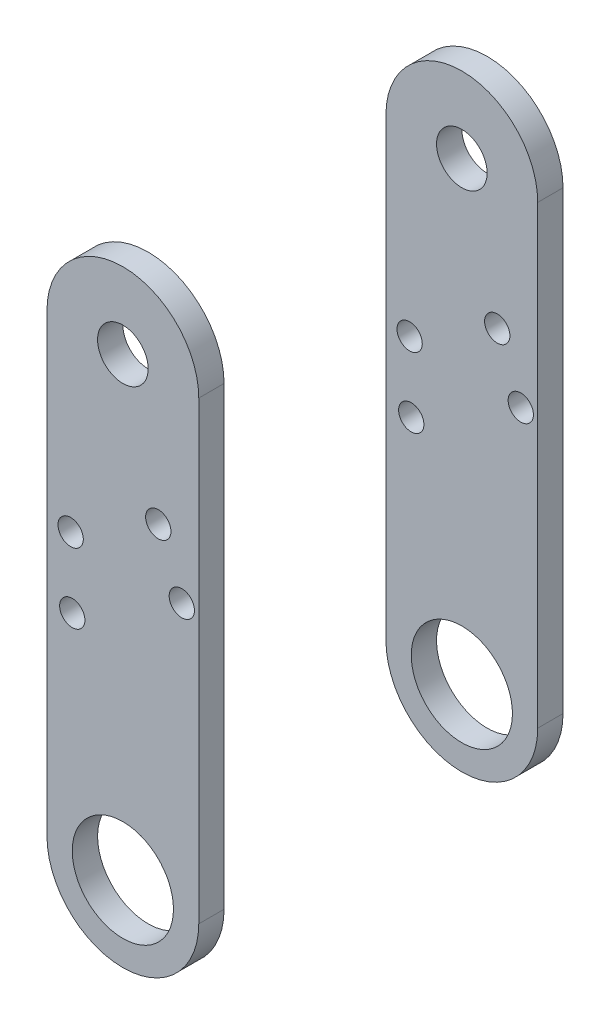
ISO-10303-21;
HEADER;
FILE_DESCRIPTION(('STEP AP214'),'2;1');
FILE_NAME('part.step','',(''),(''),'','','');
FILE_SCHEMA(('AUTOMOTIVE_DESIGN { 1 0 10303 214 1 1 1 1 }'));
ENDSEC;
DATA;
#1=APPLICATION_CONTEXT('core data for automotive mechanical design processes');
#2=APPLICATION_PROTOCOL_DEFINITION('international standard','automotive_design',2000,#1);
#3=PRODUCT_CONTEXT('',#1,'mechanical');
#4=PRODUCT('Part','Part','',(#3));
#5=PRODUCT_RELATED_PRODUCT_CATEGORY('part','',(#4));
#6=PRODUCT_DEFINITION_FORMATION('','',#4);
#7=PRODUCT_DEFINITION_CONTEXT('part definition',#1,'design');
#8=PRODUCT_DEFINITION('design','',#6,#7);
#9=PRODUCT_DEFINITION_SHAPE('','',#8);
#10=(LENGTH_UNIT() NAMED_UNIT(*) SI_UNIT(.MILLI.,.METRE.));
#11=(NAMED_UNIT(*) PLANE_ANGLE_UNIT() SI_UNIT($,.RADIAN.));
#12=(NAMED_UNIT(*) SI_UNIT($,.STERADIAN.) SOLID_ANGLE_UNIT());
#13=UNCERTAINTY_MEASURE_WITH_UNIT(LENGTH_MEASURE(1.E-05),#10,'distance_accuracy_value','');
#14=(GEOMETRIC_REPRESENTATION_CONTEXT(3) GLOBAL_UNCERTAINTY_ASSIGNED_CONTEXT((#13)) GLOBAL_UNIT_ASSIGNED_CONTEXT((#10,
#11,#12)) REPRESENTATION_CONTEXT('',''));
#15=CARTESIAN_POINT('',(0.,0.,0.));
#16=DIRECTION('',(0.,0.,1.));
#17=DIRECTION('',(1.,0.,0.));
#18=AXIS2_PLACEMENT_3D('',#15,#16,#17);
#19=CARTESIAN_POINT('',(11.650635094611,53.21224929608,72.));
#20=DIRECTION('',(0.,0.,-1.));
#21=DIRECTION('',(0.,1.,0.));
#22=AXIS2_PLACEMENT_3D('',#19,#20,#21);
#23=CYLINDRICAL_SURFACE('',#22,2.5);
#24=CARTESIAN_POINT('',(11.650635094611,53.21224929608,4.99999999999999));
#25=DIRECTION('',(0.,0.,-1.));
#26=DIRECTION('',(-1.,0.,0.));
#27=AXIS2_PLACEMENT_3D('',#24,#25,#26);
#28=CIRCLE('',#27,2.5);
#29=CARTESIAN_POINT('',(9.15063509461096,53.21224929608,4.99999999999999));
#30=VERTEX_POINT('',#29);
#31=EDGE_CURVE('E167',#30,#30,#28,.F.);
#32=ORIENTED_EDGE('',*,*,#31,.T.);
#33=EDGE_LOOP('',(#32));
#34=FACE_BOUND('',#33,.T.);
#35=CARTESIAN_POINT('',(11.650635094611,53.21224929608,0.));
#36=DIRECTION('',(0.,0.,-1.));
#37=DIRECTION('',(0.,1.,0.));
#38=AXIS2_PLACEMENT_3D('',#35,#36,#37);
#39=CIRCLE('',#38,2.5);
#40=CARTESIAN_POINT('',(11.650635094611,55.71224929608,0.));
#41=VERTEX_POINT('',#40);
#42=EDGE_CURVE('E164',#41,#41,#39,.T.);
#43=ORIENTED_EDGE('',*,*,#42,.T.);
#44=EDGE_LOOP('',(#43));
#45=FACE_BOUND('',#44,.T.);
#46=ADVANCED_FACE('F73',(#34,#45),#23,.F.);
#47=CARTESIAN_POINT('',(-10.,40.71224929608,72.));
#48=DIRECTION('',(0.,0.,-1.));
#49=DIRECTION('',(0.,1.,0.));
#50=AXIS2_PLACEMENT_3D('',#47,#48,#49);
#51=CYLINDRICAL_SURFACE('',#50,2.5);
#52=CARTESIAN_POINT('',(-10.,40.71224929608,4.99999999999999));
#53=DIRECTION('',(0.,0.,-1.));
#54=DIRECTION('',(-1.,0.,0.));
#55=AXIS2_PLACEMENT_3D('',#52,#53,#54);
#56=CIRCLE('',#55,2.5);
#57=CARTESIAN_POINT('',(-12.5,40.71224929608,4.99999999999999));
#58=VERTEX_POINT('',#57);
#59=EDGE_CURVE('E163',#58,#58,#56,.F.);
#60=ORIENTED_EDGE('',*,*,#59,.T.);
#61=EDGE_LOOP('',(#60));
#62=FACE_BOUND('',#61,.T.);
#63=CARTESIAN_POINT('',(-10.,40.71224929608,0.));
#64=DIRECTION('',(0.,0.,-1.));
#65=DIRECTION('',(0.,1.,0.));
#66=AXIS2_PLACEMENT_3D('',#63,#64,#65);
#67=CIRCLE('',#66,2.5);
#68=CARTESIAN_POINT('',(-10.,43.21224929608,0.));
#69=VERTEX_POINT('',#68);
#70=EDGE_CURVE('E160',#69,#69,#67,.T.);
#71=ORIENTED_EDGE('',*,*,#70,.T.);
#72=EDGE_LOOP('',(#71));
#73=FACE_BOUND('',#72,.T.);
#74=ADVANCED_FACE('F178',(#62,#73),#51,.F.);
#75=CARTESIAN_POINT('',(-10.3205080756888,54.4114817289327,72.));
#76=DIRECTION('',(0.,0.,-1.));
#77=DIRECTION('',(0.,1.,0.));
#78=AXIS2_PLACEMENT_3D('',#75,#76,#77);
#79=CYLINDRICAL_SURFACE('',#78,2.5);
#80=CARTESIAN_POINT('',(-10.3205080756888,54.4114817289327,4.99999999999999));
#81=DIRECTION('',(0.,0.,-1.));
#82=DIRECTION('',(-1.,0.,0.));
#83=AXIS2_PLACEMENT_3D('',#80,#81,#82);
#84=CIRCLE('',#83,2.5);
#85=CARTESIAN_POINT('',(-12.8205080756888,54.4114817289327,4.99999999999999));
#86=VERTEX_POINT('',#85);
#87=EDGE_CURVE('E77',#86,#86,#84,.F.);
#88=ORIENTED_EDGE('',*,*,#87,.T.);
#89=EDGE_LOOP('',(#88));
#90=FACE_BOUND('',#89,.T.);
#91=CARTESIAN_POINT('',(-10.3205080756888,54.4114817289327,0.));
#92=DIRECTION('',(0.,0.,-1.));
#93=DIRECTION('',(0.,1.,0.));
#94=AXIS2_PLACEMENT_3D('',#91,#92,#93);
#95=CIRCLE('',#94,2.5);
#96=CARTESIAN_POINT('',(-10.3205080756888,56.9114817289327,0.));
#97=VERTEX_POINT('',#96);
#98=EDGE_CURVE('E168',#97,#97,#95,.T.);
#99=ORIENTED_EDGE('',*,*,#98,.T.);
#100=EDGE_LOOP('',(#99));
#101=FACE_BOUND('',#100,.T.);
#102=ADVANCED_FACE('F191',(#90,#101),#79,.F.);
#103=CARTESIAN_POINT('',(7.,64.4114817289327,72.));
#104=DIRECTION('',(0.,0.,-1.));
#105=DIRECTION('',(0.,1.,0.));
#106=AXIS2_PLACEMENT_3D('',#103,#104,#105);
#107=CYLINDRICAL_SURFACE('',#106,2.5);
#108=CARTESIAN_POINT('',(7.,64.4114817289327,4.99999999999999));
#109=DIRECTION('',(0.,0.,-1.));
#110=DIRECTION('',(-1.,0.,0.));
#111=AXIS2_PLACEMENT_3D('',#108,#109,#110);
#112=CIRCLE('',#111,2.5);
#113=CARTESIAN_POINT('',(4.5,64.4114817289327,4.99999999999999));
#114=VERTEX_POINT('',#113);
#115=EDGE_CURVE('E171',#114,#114,#112,.F.);
#116=ORIENTED_EDGE('',*,*,#115,.T.);
#117=EDGE_LOOP('',(#116));
#118=FACE_BOUND('',#117,.T.);
#119=CARTESIAN_POINT('',(7.,64.4114817289327,0.));
#120=DIRECTION('',(0.,0.,-1.));
#121=DIRECTION('',(0.,1.,0.));
#122=AXIS2_PLACEMENT_3D('',#119,#120,#121);
#123=CIRCLE('',#122,2.5);
#124=CARTESIAN_POINT('',(7.,66.9114817289327,0.));
#125=VERTEX_POINT('',#124);
#126=EDGE_CURVE('E158',#125,#125,#123,.T.);
#127=ORIENTED_EDGE('',*,*,#126,.T.);
#128=EDGE_LOOP('',(#127));
#129=FACE_BOUND('',#128,.T.);
#130=ADVANCED_FACE('F75',(#118,#129),#107,.F.);
#131=CARTESIAN_POINT('',(55.,115.,4.99999999999999));
#132=DIRECTION('',(0.,0.,-1.));
#133=DIRECTION('',(0.,1.,0.));
#134=AXIS2_PLACEMENT_3D('',#131,#132,#133);
#135=PLANE('',#134);
#136=CARTESIAN_POINT('',(0.,90.,4.99999999999999));
#137=DIRECTION('',(0.,0.,-1.));
#138=DIRECTION('',(0.,1.,0.));
#139=AXIS2_PLACEMENT_3D('',#136,#137,#138);
#140=CIRCLE('',#139,15.);
#141=CARTESIAN_POINT('',(-15.,90.,5.));
#142=VERTEX_POINT('',#141);
#143=CARTESIAN_POINT('',(15.,90.,4.99999999999999));
#144=VERTEX_POINT('',#143);
#145=EDGE_CURVE('E128',#142,#144,#140,.T.);
#146=ORIENTED_EDGE('',*,*,#145,.F.);
#147=DIRECTION('',(0.,-1.,0.));
#148=VECTOR('',#147,1.);
#149=CARTESIAN_POINT('',(-15.,115.,4.99999999999999));
#150=LINE('',#149,#148);
#151=CARTESIAN_POINT('',(-15.,0.,5.00000000000002));
#152=VERTEX_POINT('',#151);
#153=EDGE_CURVE('E125',#142,#152,#150,.T.);
#154=ORIENTED_EDGE('',*,*,#153,.T.);
#155=CARTESIAN_POINT('',(0.,0.,5.00000000000002));
#156=DIRECTION('',(0.,0.,-1.));
#157=DIRECTION('',(0.,1.,0.));
#158=AXIS2_PLACEMENT_3D('',#155,#156,#157);
#159=CIRCLE('',#158,15.);
#160=CARTESIAN_POINT('',(15.,0.,5.));
#161=VERTEX_POINT('',#160);
#162=EDGE_CURVE('E111',#161,#152,#159,.T.);
#163=ORIENTED_EDGE('',*,*,#162,.F.);
#164=DIRECTION('',(0.,-1.,0.));
#165=VECTOR('',#164,1.);
#166=CARTESIAN_POINT('',(15.,90.,4.99999999999999));
#167=LINE('',#166,#165);
#168=EDGE_CURVE('E146',#144,#161,#167,.T.);
#169=ORIENTED_EDGE('',*,*,#168,.F.);
#170=EDGE_LOOP('',(#146,#154,#163,#169));
#171=FACE_BOUND('',#170,.T.);
#172=CARTESIAN_POINT('',(0.,0.,5.00000000000002));
#173=DIRECTION('',(0.,0.,-1.));
#174=DIRECTION('',(0.,1.,0.));
#175=AXIS2_PLACEMENT_3D('',#172,#173,#174);
#176=CIRCLE('',#175,10.);
#177=CARTESIAN_POINT('',(0.,10.,5.00000000000002));
#178=VERTEX_POINT('',#177);
#179=EDGE_CURVE('E132',#178,#178,#176,.T.);
#180=ORIENTED_EDGE('',*,*,#179,.T.);
#181=EDGE_LOOP('',(#180));
#182=FACE_BOUND('',#181,.T.);
#183=CARTESIAN_POINT('',(0.,90.,4.99999999999999));
#184=DIRECTION('',(0.,0.,-1.));
#185=DIRECTION('',(0.,1.,0.));
#186=AXIS2_PLACEMENT_3D('',#183,#184,#185);
#187=CIRCLE('',#186,5.);
#188=CARTESIAN_POINT('',(0.,95.,4.99999999999999));
#189=VERTEX_POINT('',#188);
#190=EDGE_CURVE('E131',#189,#189,#187,.T.);
#191=ORIENTED_EDGE('',*,*,#190,.T.);
#192=EDGE_LOOP('',(#191));
#193=FACE_BOUND('',#192,.T.);
#194=ORIENTED_EDGE('',*,*,#31,.F.);
#195=EDGE_LOOP('',(#194));
#196=FACE_BOUND('',#195,.T.);
#197=ORIENTED_EDGE('',*,*,#59,.F.);
#198=EDGE_LOOP('',(#197));
#199=FACE_BOUND('',#198,.T.);
#200=ORIENTED_EDGE('',*,*,#115,.F.);
#201=EDGE_LOOP('',(#200));
#202=FACE_BOUND('',#201,.T.);
#203=ORIENTED_EDGE('',*,*,#87,.F.);
#204=EDGE_LOOP('',(#203));
#205=FACE_BOUND('',#204,.T.);
#206=ADVANCED_FACE('F126',(#171,#182,#193,#196,#199,#202,#205),#135,.F.);
#207=CARTESIAN_POINT('',(0.,0.,72.));
#208=DIRECTION('',(0.,0.,-1.));
#209=DIRECTION('',(-1.,0.,0.));
#210=AXIS2_PLACEMENT_3D('',#207,#208,#209);
#211=CYLINDRICAL_SURFACE('',#210,10.);
#212=ORIENTED_EDGE('',*,*,#179,.F.);
#213=EDGE_LOOP('',(#212));
#214=FACE_BOUND('',#213,.T.);
#215=CARTESIAN_POINT('',(0.,0.,0.));
#216=DIRECTION('',(0.,0.,1.));
#217=DIRECTION('',(1.,0.,0.));
#218=AXIS2_PLACEMENT_3D('',#215,#216,#217);
#219=CIRCLE('',#218,10.);
#220=CARTESIAN_POINT('',(10.,0.,0.));
#221=VERTEX_POINT('',#220);
#222=EDGE_CURVE('E83',#221,#221,#219,.T.);
#223=ORIENTED_EDGE('',*,*,#222,.F.);
#224=EDGE_LOOP('',(#223));
#225=FACE_BOUND('',#224,.T.);
#226=ADVANCED_FACE('F183',(#214,#225),#211,.F.);
#227=CARTESIAN_POINT('',(15.,90.,72.));
#228=DIRECTION('',(-1.,0.,0.));
#229=DIRECTION('',(0.,-1.,0.));
#230=AXIS2_PLACEMENT_3D('',#227,#228,#229);
#231=PLANE('',#230);
#232=DIRECTION('',(0.,0.,-1.));
#233=VECTOR('',#232,1.);
#234=CARTESIAN_POINT('',(15.,90.,72.));
#235=LINE('',#234,#233);
#236=CARTESIAN_POINT('',(15.,90.,0.));
#237=VERTEX_POINT('',#236);
#238=EDGE_CURVE('E92',#144,#237,#235,.T.);
#239=ORIENTED_EDGE('',*,*,#238,.F.);
#240=ORIENTED_EDGE('',*,*,#168,.T.);
#241=DIRECTION('',(0.,0.,-1.));
#242=VECTOR('',#241,1.);
#243=CARTESIAN_POINT('',(15.,0.,72.));
#244=LINE('',#243,#242);
#245=CARTESIAN_POINT('',(15.,0.,0.));
#246=VERTEX_POINT('',#245);
#247=EDGE_CURVE('E118',#161,#246,#244,.T.);
#248=ORIENTED_EDGE('',*,*,#247,.T.);
#249=DIRECTION('',(0.,1.,0.));
#250=VECTOR('',#249,1.);
#251=CARTESIAN_POINT('',(15.,90.,0.));
#252=LINE('',#251,#250);
#253=EDGE_CURVE('E121',#246,#237,#252,.T.);
#254=ORIENTED_EDGE('',*,*,#253,.T.);
#255=EDGE_LOOP('',(#239,#240,#248,#254));
#256=FACE_BOUND('',#255,.T.);
#257=ADVANCED_FACE('F253',(#256),#231,.F.);
#258=CARTESIAN_POINT('',(0.,0.,72.));
#259=DIRECTION('',(0.,0.,-1.));
#260=DIRECTION('',(-1.,0.,0.));
#261=AXIS2_PLACEMENT_3D('',#258,#259,#260);
#262=CYLINDRICAL_SURFACE('',#261,15.);
#263=ORIENTED_EDGE('',*,*,#247,.F.);
#264=ORIENTED_EDGE('',*,*,#162,.T.);
#265=DIRECTION('',(0.,0.,-1.));
#266=VECTOR('',#265,1.);
#267=CARTESIAN_POINT('',(-15.,0.,72.));
#268=LINE('',#267,#266);
#269=CARTESIAN_POINT('',(-15.,0.,0.));
#270=VERTEX_POINT('',#269);
#271=EDGE_CURVE('E116',#152,#270,#268,.T.);
#272=ORIENTED_EDGE('',*,*,#271,.T.);
#273=CARTESIAN_POINT('',(0.,0.,0.));
#274=DIRECTION('',(0.,0.,1.));
#275=DIRECTION('',(1.,0.,0.));
#276=AXIS2_PLACEMENT_3D('',#273,#274,#275);
#277=CIRCLE('',#276,15.);
#278=EDGE_CURVE('E138',#270,#246,#277,.T.);
#279=ORIENTED_EDGE('',*,*,#278,.T.);
#280=EDGE_LOOP('',(#263,#264,#272,#279));
#281=FACE_BOUND('',#280,.T.);
#282=ADVANCED_FACE('F113',(#281),#262,.T.);
#283=CARTESIAN_POINT('',(-15.,90.,72.));
#284=DIRECTION('',(1.,0.,0.));
#285=DIRECTION('',(0.,1.,0.));
#286=AXIS2_PLACEMENT_3D('',#283,#284,#285);
#287=PLANE('',#286);
#288=ORIENTED_EDGE('',*,*,#271,.F.);
#289=ORIENTED_EDGE('',*,*,#153,.F.);
#290=DIRECTION('',(0.,0.,-1.));
#291=VECTOR('',#290,1.);
#292=CARTESIAN_POINT('',(-15.,90.,72.));
#293=LINE('',#292,#291);
#294=CARTESIAN_POINT('',(-15.,90.,0.));
#295=VERTEX_POINT('',#294);
#296=EDGE_CURVE('E140',#142,#295,#293,.T.);
#297=ORIENTED_EDGE('',*,*,#296,.T.);
#298=DIRECTION('',(0.,-1.,0.));
#299=VECTOR('',#298,1.);
#300=CARTESIAN_POINT('',(-15.,90.,0.));
#301=LINE('',#300,#299);
#302=EDGE_CURVE('E136',#295,#270,#301,.T.);
#303=ORIENTED_EDGE('',*,*,#302,.T.);
#304=EDGE_LOOP('',(#288,#289,#297,#303));
#305=FACE_BOUND('',#304,.T.);
#306=ADVANCED_FACE('F134',(#305),#287,.F.);
#307=CARTESIAN_POINT('',(0.,90.,72.));
#308=DIRECTION('',(0.,0.,-1.));
#309=DIRECTION('',(-1.,0.,0.));
#310=AXIS2_PLACEMENT_3D('',#307,#308,#309);
#311=CYLINDRICAL_SURFACE('',#310,15.);
#312=ORIENTED_EDGE('',*,*,#296,.F.);
#313=ORIENTED_EDGE('',*,*,#145,.T.);
#314=ORIENTED_EDGE('',*,*,#238,.T.);
#315=CARTESIAN_POINT('',(0.,90.,0.));
#316=DIRECTION('',(0.,0.,1.));
#317=DIRECTION('',(1.,0.,0.));
#318=AXIS2_PLACEMENT_3D('',#315,#316,#317);
#319=CIRCLE('',#318,15.);
#320=EDGE_CURVE('E148',#237,#295,#319,.T.);
#321=ORIENTED_EDGE('',*,*,#320,.T.);
#322=EDGE_LOOP('',(#312,#313,#314,#321));
#323=FACE_BOUND('',#322,.T.);
#324=ADVANCED_FACE('F200',(#323),#311,.T.);
#325=CARTESIAN_POINT('',(0.,90.,0.));
#326=DIRECTION('',(0.,0.,1.));
#327=DIRECTION('',(1.,0.,0.));
#328=AXIS2_PLACEMENT_3D('',#325,#326,#327);
#329=PLANE('',#328);
#330=ORIENTED_EDGE('',*,*,#126,.F.);
#331=EDGE_LOOP('',(#330));
#332=FACE_BOUND('',#331,.T.);
#333=ORIENTED_EDGE('',*,*,#98,.F.);
#334=EDGE_LOOP('',(#333));
#335=FACE_BOUND('',#334,.T.);
#336=ORIENTED_EDGE('',*,*,#70,.F.);
#337=EDGE_LOOP('',(#336));
#338=FACE_BOUND('',#337,.T.);
#339=ORIENTED_EDGE('',*,*,#42,.F.);
#340=EDGE_LOOP('',(#339));
#341=FACE_BOUND('',#340,.T.);
#342=ORIENTED_EDGE('',*,*,#320,.F.);
#343=ORIENTED_EDGE('',*,*,#253,.F.);
#344=ORIENTED_EDGE('',*,*,#278,.F.);
#345=ORIENTED_EDGE('',*,*,#302,.F.);
#346=EDGE_LOOP('',(#342,#343,#344,#345));
#347=FACE_BOUND('',#346,.T.);
#348=ORIENTED_EDGE('',*,*,#222,.T.);
#349=EDGE_LOOP('',(#348));
#350=FACE_BOUND('',#349,.T.);
#351=CARTESIAN_POINT('',(0.,90.,0.));
#352=DIRECTION('',(0.,0.,1.));
#353=DIRECTION('',(1.,0.,0.));
#354=AXIS2_PLACEMENT_3D('',#351,#352,#353);
#355=CIRCLE('',#354,5.);
#356=CARTESIAN_POINT('',(5.,90.,0.));
#357=VERTEX_POINT('',#356);
#358=EDGE_CURVE('E13',#357,#357,#355,.T.);
#359=ORIENTED_EDGE('',*,*,#358,.T.);
#360=EDGE_LOOP('',(#359));
#361=FACE_BOUND('',#360,.T.);
#362=ADVANCED_FACE('F196',(#332,#335,#338,#341,#347,#350,#361),#329,.F.);
#363=CARTESIAN_POINT('',(0.,90.,72.));
#364=DIRECTION('',(0.,0.,-1.));
#365=DIRECTION('',(-1.,0.,0.));
#366=AXIS2_PLACEMENT_3D('',#363,#364,#365);
#367=CYLINDRICAL_SURFACE('',#366,5.);
#368=ORIENTED_EDGE('',*,*,#190,.F.);
#369=EDGE_LOOP('',(#368));
#370=FACE_BOUND('',#369,.T.);
#371=ORIENTED_EDGE('',*,*,#358,.F.);
#372=EDGE_LOOP('',(#371));
#373=FACE_BOUND('',#372,.T.);
#374=ADVANCED_FACE('F199',(#370,#373),#367,.F.);
#375=CLOSED_SHELL('',(#46,#74,#102,#130,#206,#226,#257,#282,#306,#324,#362,#374));
#376=MANIFOLD_SOLID_BREP('B2',#375);
#377=CARTESIAN_POINT('',(0.,0.,72.));
#378=DIRECTION('',(0.,0.,-1.));
#379=DIRECTION('',(-1.,0.,0.));
#380=AXIS2_PLACEMENT_3D('',#377,#378,#379);
#381=CYLINDRICAL_SURFACE('',#380,15.);
#382=CARTESIAN_POINT('',(0.,0.,67.));
#383=DIRECTION('',(0.,0.,-1.));
#384=DIRECTION('',(-1.,0.,0.));
#385=AXIS2_PLACEMENT_3D('',#382,#383,#384);
#386=CIRCLE('',#385,15.);
#387=CARTESIAN_POINT('',(15.,0.,67.));
#388=VERTEX_POINT('',#387);
#389=CARTESIAN_POINT('',(-15.,0.,67.));
#390=VERTEX_POINT('',#389);
#391=EDGE_CURVE('E340',#388,#390,#386,.T.);
#392=ORIENTED_EDGE('',*,*,#391,.F.);
#393=DIRECTION('',(0.,0.,-1.));
#394=VECTOR('',#393,1.);
#395=CARTESIAN_POINT('',(15.,0.,72.));
#396=LINE('',#395,#394);
#397=CARTESIAN_POINT('',(15.,0.,72.));
#398=VERTEX_POINT('',#397);
#399=EDGE_CURVE('E387',#398,#388,#396,.T.);
#400=ORIENTED_EDGE('',*,*,#399,.F.);
#401=CARTESIAN_POINT('',(0.,0.,72.));
#402=DIRECTION('',(0.,0.,1.));
#403=DIRECTION('',(1.,0.,0.));
#404=AXIS2_PLACEMENT_3D('',#401,#402,#403);
#405=CIRCLE('',#404,15.);
#406=CARTESIAN_POINT('',(-15.,0.,72.));
#407=VERTEX_POINT('',#406);
#408=EDGE_CURVE('E417',#407,#398,#405,.T.);
#409=ORIENTED_EDGE('',*,*,#408,.F.);
#410=DIRECTION('',(0.,0.,-1.));
#411=VECTOR('',#410,1.);
#412=CARTESIAN_POINT('',(-15.,0.,72.));
#413=LINE('',#412,#411);
#414=EDGE_CURVE('E394',#407,#390,#413,.T.);
#415=ORIENTED_EDGE('',*,*,#414,.T.);
#416=EDGE_LOOP('',(#392,#400,#409,#415));
#417=FACE_BOUND('',#416,.T.);
#418=ADVANCED_FACE('F331',(#417),#381,.T.);
#419=CARTESIAN_POINT('',(0.,0.,72.));
#420=DIRECTION('',(0.,0.,-1.));
#421=DIRECTION('',(-1.,0.,0.));
#422=AXIS2_PLACEMENT_3D('',#419,#420,#421);
#423=CYLINDRICAL_SURFACE('',#422,10.);
#424=CARTESIAN_POINT('',(0.,0.,72.));
#425=DIRECTION('',(0.,0.,1.));
#426=DIRECTION('',(1.,0.,0.));
#427=AXIS2_PLACEMENT_3D('',#424,#425,#426);
#428=CIRCLE('',#427,10.);
#429=CARTESIAN_POINT('',(10.,0.,72.));
#430=VERTEX_POINT('',#429);
#431=EDGE_CURVE('E401',#430,#430,#428,.T.);
#432=ORIENTED_EDGE('',*,*,#431,.T.);
#433=EDGE_LOOP('',(#432));
#434=FACE_BOUND('',#433,.T.);
#435=CARTESIAN_POINT('',(0.,0.,67.));
#436=DIRECTION('',(0.,0.,-1.));
#437=DIRECTION('',(-1.,0.,0.));
#438=AXIS2_PLACEMENT_3D('',#435,#436,#437);
#439=CIRCLE('',#438,10.);
#440=CARTESIAN_POINT('',(-10.,0.,67.));
#441=VERTEX_POINT('',#440);
#442=EDGE_CURVE('E404',#441,#441,#439,.T.);
#443=ORIENTED_EDGE('',*,*,#442,.T.);
#444=EDGE_LOOP('',(#443));
#445=FACE_BOUND('',#444,.T.);
#446=ADVANCED_FACE('F459',(#434,#445),#423,.F.);
#447=CARTESIAN_POINT('',(0.,90.,72.));
#448=DIRECTION('',(0.,0.,-1.));
#449=DIRECTION('',(-1.,0.,0.));
#450=AXIS2_PLACEMENT_3D('',#447,#448,#449);
#451=CYLINDRICAL_SURFACE('',#450,15.);
#452=CARTESIAN_POINT('',(0.,90.,67.));
#453=DIRECTION('',(0.,0.,-1.));
#454=DIRECTION('',(-1.,0.,0.));
#455=AXIS2_PLACEMENT_3D('',#452,#453,#454);
#456=CIRCLE('',#455,15.);
#457=CARTESIAN_POINT('',(-15.,90.,67.));
#458=VERTEX_POINT('',#457);
#459=CARTESIAN_POINT('',(15.,90.,67.));
#460=VERTEX_POINT('',#459);
#461=EDGE_CURVE('E368',#458,#460,#456,.T.);
#462=ORIENTED_EDGE('',*,*,#461,.F.);
#463=DIRECTION('',(0.,0.,-1.));
#464=VECTOR('',#463,1.);
#465=CARTESIAN_POINT('',(-15.,90.,72.));
#466=LINE('',#465,#464);
#467=CARTESIAN_POINT('',(-15.,90.,72.));
#468=VERTEX_POINT('',#467);
#469=EDGE_CURVE('E392',#468,#458,#466,.T.);
#470=ORIENTED_EDGE('',*,*,#469,.F.);
#471=CARTESIAN_POINT('',(0.,90.,72.));
#472=DIRECTION('',(0.,0.,1.));
#473=DIRECTION('',(1.,0.,0.));
#474=AXIS2_PLACEMENT_3D('',#471,#472,#473);
#475=CIRCLE('',#474,15.);
#476=CARTESIAN_POINT('',(15.,90.,72.));
#477=VERTEX_POINT('',#476);
#478=EDGE_CURVE('E391',#477,#468,#475,.T.);
#479=ORIENTED_EDGE('',*,*,#478,.F.);
#480=DIRECTION('',(0.,0.,-1.));
#481=VECTOR('',#480,1.);
#482=CARTESIAN_POINT('',(15.,90.,72.));
#483=LINE('',#482,#481);
#484=EDGE_CURVE('E384',#477,#460,#483,.T.);
#485=ORIENTED_EDGE('',*,*,#484,.T.);
#486=EDGE_LOOP('',(#462,#470,#479,#485));
#487=FACE_BOUND('',#486,.T.);
#488=ADVANCED_FACE('F389',(#487),#451,.T.);
#489=CARTESIAN_POINT('',(0.,90.,72.));
#490=DIRECTION('',(0.,0.,-1.));
#491=DIRECTION('',(-1.,0.,0.));
#492=AXIS2_PLACEMENT_3D('',#489,#490,#491);
#493=CYLINDRICAL_SURFACE('',#492,5.);
#494=CARTESIAN_POINT('',(0.,90.,72.));
#495=DIRECTION('',(0.,0.,1.));
#496=DIRECTION('',(1.,0.,0.));
#497=AXIS2_PLACEMENT_3D('',#494,#495,#496);
#498=CIRCLE('',#497,5.);
#499=CARTESIAN_POINT('',(5.,90.,72.));
#500=VERTEX_POINT('',#499);
#501=EDGE_CURVE('E406',#500,#500,#498,.T.);
#502=ORIENTED_EDGE('',*,*,#501,.T.);
#503=EDGE_LOOP('',(#502));
#504=FACE_BOUND('',#503,.T.);
#505=CARTESIAN_POINT('',(0.,90.,67.));
#506=DIRECTION('',(0.,0.,-1.));
#507=DIRECTION('',(-1.,0.,0.));
#508=AXIS2_PLACEMENT_3D('',#505,#506,#507);
#509=CIRCLE('',#508,5.);
#510=CARTESIAN_POINT('',(-5.,90.,67.));
#511=VERTEX_POINT('',#510);
#512=EDGE_CURVE('E411',#511,#511,#509,.T.);
#513=ORIENTED_EDGE('',*,*,#512,.T.);
#514=EDGE_LOOP('',(#513));
#515=FACE_BOUND('',#514,.T.);
#516=ADVANCED_FACE('F333',(#504,#515),#493,.F.);
#517=CARTESIAN_POINT('',(55.,115.,67.));
#518=DIRECTION('',(0.,0.,-1.));
#519=DIRECTION('',(-1.,0.,0.));
#520=AXIS2_PLACEMENT_3D('',#517,#518,#519);
#521=PLANE('',#520);
#522=ORIENTED_EDGE('',*,*,#391,.T.);
#523=DIRECTION('',(0.,-1.,0.));
#524=VECTOR('',#523,1.);
#525=CARTESIAN_POINT('',(-15.,115.,67.));
#526=LINE('',#525,#524);
#527=EDGE_CURVE('E71',#458,#390,#526,.T.);
#528=ORIENTED_EDGE('',*,*,#527,.F.);
#529=ORIENTED_EDGE('',*,*,#461,.T.);
#530=DIRECTION('',(0.,-1.,0.));
#531=VECTOR('',#530,1.);
#532=CARTESIAN_POINT('',(15.,90.,67.));
#533=LINE('',#532,#531);
#534=EDGE_CURVE('E372',#460,#388,#533,.T.);
#535=ORIENTED_EDGE('',*,*,#534,.T.);
#536=EDGE_LOOP('',(#522,#528,#529,#535));
#537=FACE_BOUND('',#536,.T.);
#538=ORIENTED_EDGE('',*,*,#512,.F.);
#539=EDGE_LOOP('',(#538));
#540=FACE_BOUND('',#539,.T.);
#541=CARTESIAN_POINT('',(11.650635094611,53.21224929608,67.));
#542=DIRECTION('',(0.,0.,1.));
#543=DIRECTION('',(1.,0.,0.));
#544=AXIS2_PLACEMENT_3D('',#541,#542,#543);
#545=CIRCLE('',#544,2.5);
#546=CARTESIAN_POINT('',(14.150635094611,53.21224929608,67.));
#547=VERTEX_POINT('',#546);
#548=EDGE_CURVE('E429',#547,#547,#545,.F.);
#549=ORIENTED_EDGE('',*,*,#548,.F.);
#550=EDGE_LOOP('',(#549));
#551=FACE_BOUND('',#550,.T.);
#552=CARTESIAN_POINT('',(-10.,40.71224929608,67.));
#553=DIRECTION('',(0.,0.,1.));
#554=DIRECTION('',(1.,0.,0.));
#555=AXIS2_PLACEMENT_3D('',#552,#553,#554);
#556=CIRCLE('',#555,2.5);
#557=CARTESIAN_POINT('',(-7.50000000000001,40.71224929608,67.));
#558=VERTEX_POINT('',#557);
#559=EDGE_CURVE('E433',#558,#558,#556,.F.);
#560=ORIENTED_EDGE('',*,*,#559,.F.);
#561=EDGE_LOOP('',(#560));
#562=FACE_BOUND('',#561,.T.);
#563=ORIENTED_EDGE('',*,*,#442,.F.);
#564=EDGE_LOOP('',(#563));
#565=FACE_BOUND('',#564,.T.);
#566=CARTESIAN_POINT('',(7.,64.4114817289327,67.));
#567=DIRECTION('',(0.,0.,1.));
#568=DIRECTION('',(1.,0.,0.));
#569=AXIS2_PLACEMENT_3D('',#566,#567,#568);
#570=CIRCLE('',#569,2.5);
#571=CARTESIAN_POINT('',(9.5,64.4114817289327,67.));
#572=VERTEX_POINT('',#571);
#573=EDGE_CURVE('E335',#572,#572,#570,.F.);
#574=ORIENTED_EDGE('',*,*,#573,.F.);
#575=EDGE_LOOP('',(#574));
#576=FACE_BOUND('',#575,.T.);
#577=CARTESIAN_POINT('',(-10.3205080756888,54.4114817289327,67.));
#578=DIRECTION('',(0.,0.,1.));
#579=DIRECTION('',(1.,0.,0.));
#580=AXIS2_PLACEMENT_3D('',#577,#578,#579);
#581=CIRCLE('',#580,2.5);
#582=CARTESIAN_POINT('',(-7.82050807568877,54.4114817289327,67.));
#583=VERTEX_POINT('',#582);
#584=EDGE_CURVE('E436',#583,#583,#581,.F.);
#585=ORIENTED_EDGE('',*,*,#584,.F.);
#586=EDGE_LOOP('',(#585));
#587=FACE_BOUND('',#586,.T.);
#588=ADVANCED_FACE('F370',(#537,#540,#551,#562,#565,#576,#587),#521,.T.);
#589=CARTESIAN_POINT('',(15.,90.,72.));
#590=DIRECTION('',(-1.,0.,0.));
#591=DIRECTION('',(0.,-1.,0.));
#592=AXIS2_PLACEMENT_3D('',#589,#590,#591);
#593=PLANE('',#592);
#594=ORIENTED_EDGE('',*,*,#534,.F.);
#595=ORIENTED_EDGE('',*,*,#484,.F.);
#596=DIRECTION('',(0.,1.,0.));
#597=VECTOR('',#596,1.);
#598=CARTESIAN_POINT('',(15.,90.,72.));
#599=LINE('',#598,#597);
#600=EDGE_CURVE('E377',#398,#477,#599,.T.);
#601=ORIENTED_EDGE('',*,*,#600,.F.);
#602=ORIENTED_EDGE('',*,*,#399,.T.);
#603=EDGE_LOOP('',(#594,#595,#601,#602));
#604=FACE_BOUND('',#603,.T.);
#605=ADVANCED_FACE('F382',(#604),#593,.F.);
#606=CARTESIAN_POINT('',(-15.,90.,72.));
#607=DIRECTION('',(1.,0.,0.));
#608=DIRECTION('',(0.,1.,0.));
#609=AXIS2_PLACEMENT_3D('',#606,#607,#608);
#610=PLANE('',#609);
#611=ORIENTED_EDGE('',*,*,#469,.T.);
#612=ORIENTED_EDGE('',*,*,#527,.T.);
#613=ORIENTED_EDGE('',*,*,#414,.F.);
#614=DIRECTION('',(0.,-1.,0.));
#615=VECTOR('',#614,1.);
#616=CARTESIAN_POINT('',(-15.,90.,72.));
#617=LINE('',#616,#615);
#618=EDGE_CURVE('E415',#468,#407,#617,.T.);
#619=ORIENTED_EDGE('',*,*,#618,.F.);
#620=EDGE_LOOP('',(#611,#612,#613,#619));
#621=FACE_BOUND('',#620,.T.);
#622=ADVANCED_FACE('F453',(#621),#610,.F.);
#623=CARTESIAN_POINT('',(11.650635094611,53.21224929608,72.));
#624=DIRECTION('',(0.,0.,-1.));
#625=DIRECTION('',(0.,1.,0.));
#626=AXIS2_PLACEMENT_3D('',#623,#624,#625);
#627=CYLINDRICAL_SURFACE('',#626,2.5);
#628=ORIENTED_EDGE('',*,*,#548,.T.);
#629=EDGE_LOOP('',(#628));
#630=FACE_BOUND('',#629,.T.);
#631=CARTESIAN_POINT('',(11.650635094611,53.21224929608,72.));
#632=DIRECTION('',(0.,0.,-1.));
#633=DIRECTION('',(0.,1.,0.));
#634=AXIS2_PLACEMENT_3D('',#631,#632,#633);
#635=CIRCLE('',#634,2.5);
#636=CARTESIAN_POINT('',(11.650635094611,55.71224929608,72.));
#637=VERTEX_POINT('',#636);
#638=EDGE_CURVE('E397',#637,#637,#635,.T.);
#639=ORIENTED_EDGE('',*,*,#638,.F.);
#640=EDGE_LOOP('',(#639));
#641=FACE_BOUND('',#640,.T.);
#642=ADVANCED_FACE('F468',(#630,#641),#627,.F.);
#643=CARTESIAN_POINT('',(-10.,40.71224929608,72.));
#644=DIRECTION('',(0.,0.,-1.));
#645=DIRECTION('',(0.,1.,0.));
#646=AXIS2_PLACEMENT_3D('',#643,#644,#645);
#647=CYLINDRICAL_SURFACE('',#646,2.5);
#648=ORIENTED_EDGE('',*,*,#559,.T.);
#649=EDGE_LOOP('',(#648));
#650=FACE_BOUND('',#649,.T.);
#651=CARTESIAN_POINT('',(-10.,40.71224929608,72.));
#652=DIRECTION('',(0.,0.,-1.));
#653=DIRECTION('',(0.,1.,0.));
#654=AXIS2_PLACEMENT_3D('',#651,#652,#653);
#655=CIRCLE('',#654,2.5);
#656=CARTESIAN_POINT('',(-10.,43.2122492960801,72.));
#657=VERTEX_POINT('',#656);
#658=EDGE_CURVE('E422',#657,#657,#655,.T.);
#659=ORIENTED_EDGE('',*,*,#658,.F.);
#660=EDGE_LOOP('',(#659));
#661=FACE_BOUND('',#660,.T.);
#662=ADVANCED_FACE('F522',(#650,#661),#647,.F.);
#663=CARTESIAN_POINT('',(-10.3205080756888,54.4114817289327,72.));
#664=DIRECTION('',(0.,0.,-1.));
#665=DIRECTION('',(0.,1.,0.));
#666=AXIS2_PLACEMENT_3D('',#663,#664,#665);
#667=CYLINDRICAL_SURFACE('',#666,2.5);
#668=ORIENTED_EDGE('',*,*,#584,.T.);
#669=EDGE_LOOP('',(#668));
#670=FACE_BOUND('',#669,.T.);
#671=CARTESIAN_POINT('',(-10.3205080756888,54.4114817289327,72.));
#672=DIRECTION('',(0.,0.,-1.));
#673=DIRECTION('',(0.,1.,0.));
#674=AXIS2_PLACEMENT_3D('',#671,#672,#673);
#675=CIRCLE('',#674,2.5);
#676=CARTESIAN_POINT('',(-10.3205080756888,56.9114817289327,72.));
#677=VERTEX_POINT('',#676);
#678=EDGE_CURVE('E425',#677,#677,#675,.T.);
#679=ORIENTED_EDGE('',*,*,#678,.F.);
#680=EDGE_LOOP('',(#679));
#681=FACE_BOUND('',#680,.T.);
#682=ADVANCED_FACE('F489',(#670,#681),#667,.F.);
#683=CARTESIAN_POINT('',(0.,90.,72.));
#684=DIRECTION('',(0.,0.,1.));
#685=DIRECTION('',(1.,0.,0.));
#686=AXIS2_PLACEMENT_3D('',#683,#684,#685);
#687=PLANE('',#686);
#688=CARTESIAN_POINT('',(7.,64.4114817289327,72.));
#689=DIRECTION('',(0.,0.,-1.));
#690=DIRECTION('',(0.,1.,0.));
#691=AXIS2_PLACEMENT_3D('',#688,#689,#690);
#692=CIRCLE('',#691,2.5);
#693=CARTESIAN_POINT('',(7.,66.9114817289327,72.));
#694=VERTEX_POINT('',#693);
#695=EDGE_CURVE('E393',#694,#694,#692,.T.);
#696=ORIENTED_EDGE('',*,*,#695,.T.);
#697=EDGE_LOOP('',(#696));
#698=FACE_BOUND('',#697,.T.);
#699=ORIENTED_EDGE('',*,*,#678,.T.);
#700=EDGE_LOOP('',(#699));
#701=FACE_BOUND('',#700,.T.);
#702=ORIENTED_EDGE('',*,*,#658,.T.);
#703=EDGE_LOOP('',(#702));
#704=FACE_BOUND('',#703,.T.);
#705=ORIENTED_EDGE('',*,*,#638,.T.);
#706=EDGE_LOOP('',(#705));
#707=FACE_BOUND('',#706,.T.);
#708=ORIENTED_EDGE('',*,*,#431,.F.);
#709=EDGE_LOOP('',(#708));
#710=FACE_BOUND('',#709,.T.);
#711=ORIENTED_EDGE('',*,*,#478,.T.);
#712=ORIENTED_EDGE('',*,*,#618,.T.);
#713=ORIENTED_EDGE('',*,*,#408,.T.);
#714=ORIENTED_EDGE('',*,*,#600,.T.);
#715=EDGE_LOOP('',(#711,#712,#713,#714));
#716=FACE_BOUND('',#715,.T.);
#717=ORIENTED_EDGE('',*,*,#501,.F.);
#718=EDGE_LOOP('',(#717));
#719=FACE_BOUND('',#718,.T.);
#720=ADVANCED_FACE('F486',(#698,#701,#704,#707,#710,#716,#719),#687,.T.);
#721=CARTESIAN_POINT('',(7.,64.4114817289327,72.));
#722=DIRECTION('',(0.,0.,-1.));
#723=DIRECTION('',(0.,1.,0.));
#724=AXIS2_PLACEMENT_3D('',#721,#722,#723);
#725=CYLINDRICAL_SURFACE('',#724,2.5);
#726=ORIENTED_EDGE('',*,*,#573,.T.);
#727=EDGE_LOOP('',(#726));
#728=FACE_BOUND('',#727,.T.);
#729=ORIENTED_EDGE('',*,*,#695,.F.);
#730=EDGE_LOOP('',(#729));
#731=FACE_BOUND('',#730,.T.);
#732=ADVANCED_FACE('F443',(#728,#731),#725,.F.);
#733=CLOSED_SHELL('',(#418,#446,#488,#516,#588,#605,#622,#642,#662,#682,#720,#732));
#734=MANIFOLD_SOLID_BREP('B7',#733);
#735=ADVANCED_BREP_SHAPE_REPRESENTATION('',(#18,#376,#734),#14);
#736=SHAPE_DEFINITION_REPRESENTATION(#9,#735);
ENDSEC;
END-ISO-10303-21;
